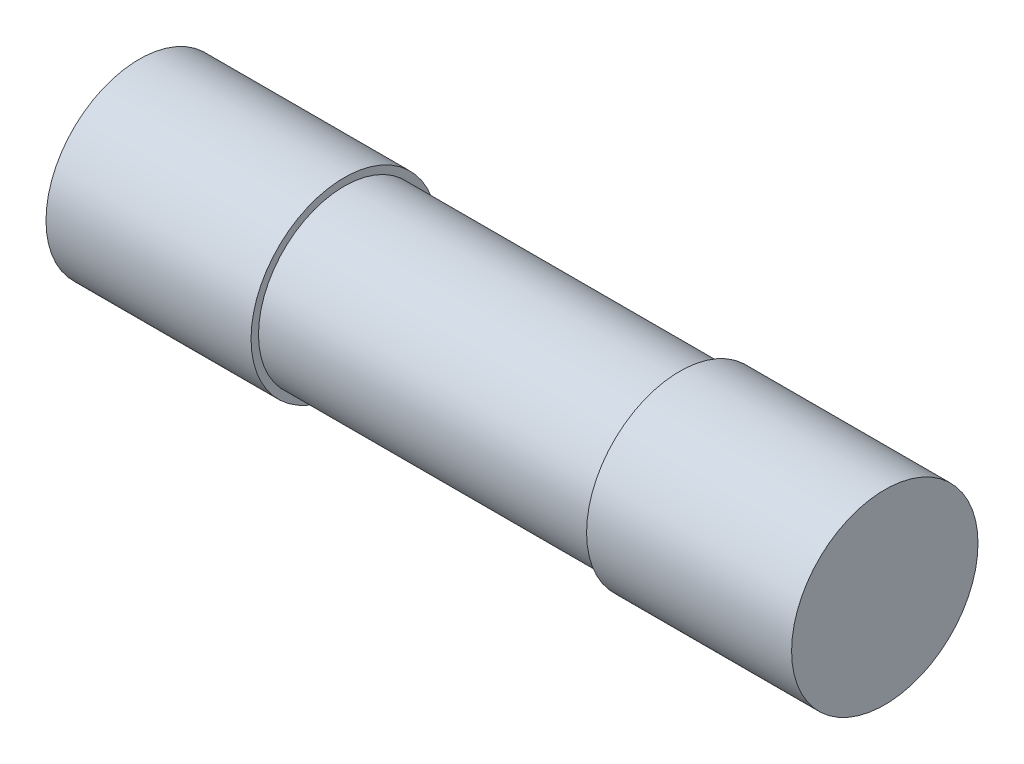
ISO-10303-21;
HEADER;
FILE_DESCRIPTION(('STEP AP214'),'2;1');
FILE_NAME('part.step','',(''),(''),'','','');
FILE_SCHEMA(('AUTOMOTIVE_DESIGN { 1 0 10303 214 1 1 1 1 }'));
ENDSEC;
DATA;
#1=APPLICATION_CONTEXT('core data for automotive mechanical design processes');
#2=APPLICATION_PROTOCOL_DEFINITION('international standard','automotive_design',2000,#1);
#3=PRODUCT_CONTEXT('',#1,'mechanical');
#4=PRODUCT('Part','Part','',(#3));
#5=PRODUCT_RELATED_PRODUCT_CATEGORY('part','',(#4));
#6=PRODUCT_DEFINITION_FORMATION('','',#4);
#7=PRODUCT_DEFINITION_CONTEXT('part definition',#1,'design');
#8=PRODUCT_DEFINITION('design','',#6,#7);
#9=PRODUCT_DEFINITION_SHAPE('','',#8);
#10=(LENGTH_UNIT() NAMED_UNIT(*) SI_UNIT(.MILLI.,.METRE.));
#11=(NAMED_UNIT(*) PLANE_ANGLE_UNIT() SI_UNIT($,.RADIAN.));
#12=(NAMED_UNIT(*) SI_UNIT($,.STERADIAN.) SOLID_ANGLE_UNIT());
#13=UNCERTAINTY_MEASURE_WITH_UNIT(LENGTH_MEASURE(1.E-05),#10,'distance_accuracy_value','');
#14=(GEOMETRIC_REPRESENTATION_CONTEXT(3) GLOBAL_UNCERTAINTY_ASSIGNED_CONTEXT((#13)) GLOBAL_UNIT_ASSIGNED_CONTEXT((#10,
#11,#12)) REPRESENTATION_CONTEXT('',''));
#15=CARTESIAN_POINT('',(0.,0.,0.));
#16=DIRECTION('',(0.,0.,1.));
#17=DIRECTION('',(1.,0.,0.));
#18=AXIS2_PLACEMENT_3D('',#15,#16,#17);
#19=CARTESIAN_POINT('',(20.,0.,0.));
#20=DIRECTION('',(-1.,0.,0.));
#21=DIRECTION('',(0.,0.,1.));
#22=AXIS2_PLACEMENT_3D('',#19,#20,#21);
#23=CYLINDRICAL_SURFACE('',#22,2.5);
#24=CARTESIAN_POINT('',(5.5,0.,0.));
#25=DIRECTION('',(-1.,0.,0.));
#26=DIRECTION('',(0.,0.,1.));
#27=AXIS2_PLACEMENT_3D('',#24,#25,#26);
#28=CIRCLE('',#27,2.5);
#29=CARTESIAN_POINT('',(5.5,0.,2.5));
#30=VERTEX_POINT('',#29);
#31=EDGE_CURVE('E66',#30,#30,#28,.T.);
#32=ORIENTED_EDGE('',*,*,#31,.T.);
#33=EDGE_LOOP('',(#32));
#34=FACE_BOUND('',#33,.T.);
#35=CARTESIAN_POINT('',(0.,0.,0.));
#36=DIRECTION('',(1.,0.,0.));
#37=DIRECTION('',(0.,0.,-1.));
#38=AXIS2_PLACEMENT_3D('',#35,#36,#37);
#39=CIRCLE('',#38,2.5);
#40=CARTESIAN_POINT('',(0.,0.,-2.5));
#41=VERTEX_POINT('',#40);
#42=EDGE_CURVE('E46',#41,#41,#39,.T.);
#43=ORIENTED_EDGE('',*,*,#42,.T.);
#44=EDGE_LOOP('',(#43));
#45=FACE_BOUND('',#44,.T.);
#46=ADVANCED_FACE('F35',(#34,#45),#23,.T.);
#47=CARTESIAN_POINT('',(0.,0.,0.));
#48=DIRECTION('',(1.,0.,0.));
#49=DIRECTION('',(0.,0.,-1.));
#50=AXIS2_PLACEMENT_3D('',#47,#48,#49);
#51=PLANE('',#50);
#52=ORIENTED_EDGE('',*,*,#42,.F.);
#53=EDGE_LOOP('',(#52));
#54=FACE_BOUND('',#53,.T.);
#55=ADVANCED_FACE('F99',(#54),#51,.F.);
#56=CARTESIAN_POINT('',(27.0710678118655,0.,0.));
#57=DIRECTION('',(-1.,0.,0.));
#58=DIRECTION('',(0.,0.,1.));
#59=AXIS2_PLACEMENT_3D('',#56,#57,#58);
#60=CYLINDRICAL_SURFACE('',#59,2.3);
#61=CARTESIAN_POINT('',(5.5,0.,0.));
#62=DIRECTION('',(-1.,0.,0.));
#63=DIRECTION('',(0.,0.,1.));
#64=AXIS2_PLACEMENT_3D('',#61,#62,#63);
#65=CIRCLE('',#64,2.3);
#66=CARTESIAN_POINT('',(5.5,0.,2.3));
#67=VERTEX_POINT('',#66);
#68=EDGE_CURVE('E62',#67,#67,#65,.T.);
#69=CARTESIAN_POINT('',(14.5,0.,0.));
#70=DIRECTION('',(1.,0.,0.));
#71=DIRECTION('',(0.,0.,-1.));
#72=AXIS2_PLACEMENT_3D('',#69,#70,#71);
#73=CIRCLE('',#72,2.3);
#74=CARTESIAN_POINT('',(14.5,0.,2.3));
#75=VERTEX_POINT('',#74);
#76=EDGE_CURVE('E56',#75,#75,#73,.F.);
#77=CARTESIAN_POINT('',(5.5,0.,2.3));
#78=CARTESIAN_POINT('',(5.59375,0.,2.3));
#79=CARTESIAN_POINT('',(5.6875,0.,2.3));
#80=CARTESIAN_POINT('',(5.875,0.,2.3));
#81=CARTESIAN_POINT('',(5.96875,0.,2.3));
#82=CARTESIAN_POINT('',(6.15625,0.,2.3));
#83=CARTESIAN_POINT('',(6.25,0.,2.3));
#84=CARTESIAN_POINT('',(6.4375,0.,2.3));
#85=CARTESIAN_POINT('',(6.53125,0.,2.3));
#86=CARTESIAN_POINT('',(6.71875,0.,2.3));
#87=CARTESIAN_POINT('',(6.8125,0.,2.3));
#88=CARTESIAN_POINT('',(7.,0.,2.3));
#89=CARTESIAN_POINT('',(7.09375,0.,2.3));
#90=CARTESIAN_POINT('',(7.28125,0.,2.3));
#91=CARTESIAN_POINT('',(7.375,0.,2.3));
#92=CARTESIAN_POINT('',(7.5625,0.,2.3));
#93=CARTESIAN_POINT('',(7.65625,0.,2.3));
#94=CARTESIAN_POINT('',(7.84375,0.,2.3));
#95=CARTESIAN_POINT('',(7.9375,0.,2.3));
#96=CARTESIAN_POINT('',(8.125,0.,2.3));
#97=CARTESIAN_POINT('',(8.21875,0.,2.3));
#98=CARTESIAN_POINT('',(8.40625,0.,2.3));
#99=CARTESIAN_POINT('',(8.5,0.,2.3));
#100=CARTESIAN_POINT('',(8.6875,0.,2.3));
#101=CARTESIAN_POINT('',(8.78125,0.,2.3));
#102=CARTESIAN_POINT('',(8.96875,0.,2.3));
#103=CARTESIAN_POINT('',(9.0625,0.,2.3));
#104=CARTESIAN_POINT('',(9.25,0.,2.3));
#105=CARTESIAN_POINT('',(9.34375,0.,2.3));
#106=CARTESIAN_POINT('',(9.53125,0.,2.3));
#107=CARTESIAN_POINT('',(9.625,0.,2.3));
#108=CARTESIAN_POINT('',(9.8125,0.,2.3));
#109=CARTESIAN_POINT('',(9.90625,0.,2.3));
#110=CARTESIAN_POINT('',(10.09375,0.,2.3));
#111=CARTESIAN_POINT('',(10.1875,0.,2.3));
#112=CARTESIAN_POINT('',(10.375,0.,2.3));
#113=CARTESIAN_POINT('',(10.46875,0.,2.3));
#114=CARTESIAN_POINT('',(10.65625,0.,2.3));
#115=CARTESIAN_POINT('',(10.75,0.,2.3));
#116=CARTESIAN_POINT('',(10.9375,0.,2.3));
#117=CARTESIAN_POINT('',(11.03125,0.,2.3));
#118=CARTESIAN_POINT('',(11.21875,0.,2.3));
#119=CARTESIAN_POINT('',(11.3125,0.,2.3));
#120=CARTESIAN_POINT('',(11.5,0.,2.3));
#121=CARTESIAN_POINT('',(11.59375,0.,2.3));
#122=CARTESIAN_POINT('',(11.78125,0.,2.3));
#123=CARTESIAN_POINT('',(11.875,0.,2.3));
#124=CARTESIAN_POINT('',(12.0625,0.,2.3));
#125=CARTESIAN_POINT('',(12.15625,0.,2.3));
#126=CARTESIAN_POINT('',(12.34375,0.,2.3));
#127=CARTESIAN_POINT('',(12.4375,0.,2.3));
#128=CARTESIAN_POINT('',(12.625,0.,2.3));
#129=CARTESIAN_POINT('',(12.71875,0.,2.3));
#130=CARTESIAN_POINT('',(12.90625,0.,2.3));
#131=CARTESIAN_POINT('',(13.,0.,2.3));
#132=CARTESIAN_POINT('',(13.1875,0.,2.3));
#133=CARTESIAN_POINT('',(13.28125,0.,2.3));
#134=CARTESIAN_POINT('',(13.46875,0.,2.3));
#135=CARTESIAN_POINT('',(13.5625,0.,2.3));
#136=CARTESIAN_POINT('',(13.75,0.,2.3));
#137=CARTESIAN_POINT('',(13.84375,0.,2.3));
#138=CARTESIAN_POINT('',(14.03125,0.,2.3));
#139=CARTESIAN_POINT('',(14.125,0.,2.3));
#140=CARTESIAN_POINT('',(14.3125,0.,2.3));
#141=CARTESIAN_POINT('',(14.40625,0.,2.3));
#142=CARTESIAN_POINT('',(14.5,0.,2.3));
#143=B_SPLINE_CURVE_WITH_KNOTS('',3,(#77,#78,#79,#80,#81,#82,#83,#84,#85,#86,#87,#88,#89,#90,
#91,#92,#93,#94,#95,#96,#97,#98,#99,#100,#101,#102,#103,#104,#105,#106,#107,#108,#109,#110,#111,
#112,#113,#114,#115,#116,#117,#118,#119,#120,#121,#122,#123,#124,#125,#126,#127,#128,#129,#130,
#131,#132,#133,#134,#135,#136,#137,#138,#139,#140,#141,#142),.UNSPECIFIED.,.F.,.F.,(4,2,2,2,2,2,
2,2,2,2,2,2,2,2,2,2,2,2,2,2,2,2,2,2,2,2,2,2,2,2,2,2,4),(0.,0.28125,0.5625,0.843750000000001,
1.125,1.40625,1.6875,1.96875,2.25,2.53125,2.8125,3.09375,3.375,3.65625,3.9375,4.21875,4.5,
4.78125,5.0625,5.34375,5.625,5.90625,6.1875,6.46875,6.75,7.03125,7.3125,7.59375,7.875,8.15625,
8.4375,8.71875,9.),.UNSPECIFIED.);
#144=EDGE_CURVE('BSEAM101',#67,#75,#143,.T.);
#145=ORIENTED_EDGE('',*,*,#68,.F.);
#146=ORIENTED_EDGE('',*,*,#76,.T.);
#147=ORIENTED_EDGE('',*,*,#144,.T.);
#148=ORIENTED_EDGE('',*,*,#144,.F.);
#149=EDGE_LOOP('',(#145,#147,#146,#148));
#150=FACE_BOUND('',#149,.T.);
#151=ADVANCED_FACE('F101',(#150),#60,.T.);
#152=CARTESIAN_POINT('',(5.5,0.,0.));
#153=DIRECTION('',(-1.,0.,0.));
#154=DIRECTION('',(0.,0.,1.));
#155=AXIS2_PLACEMENT_3D('',#152,#153,#154);
#156=PLANE('',#155);
#157=ORIENTED_EDGE('',*,*,#68,.T.);
#158=EDGE_LOOP('',(#157));
#159=FACE_BOUND('',#158,.T.);
#160=ORIENTED_EDGE('',*,*,#31,.F.);
#161=EDGE_LOOP('',(#160));
#162=FACE_BOUND('',#161,.T.);
#163=ADVANCED_FACE('F107',(#159,#162),#156,.F.);
#164=CARTESIAN_POINT('',(14.5,0.,0.));
#165=DIRECTION('',(1.,0.,0.));
#166=DIRECTION('',(0.,0.,-1.));
#167=AXIS2_PLACEMENT_3D('',#164,#165,#166);
#168=PLANE('',#167);
#169=CARTESIAN_POINT('',(14.5,0.,0.));
#170=DIRECTION('',(1.,0.,0.));
#171=DIRECTION('',(0.,0.,-1.));
#172=AXIS2_PLACEMENT_3D('',#169,#170,#171);
#173=CIRCLE('',#172,2.5);
#174=CARTESIAN_POINT('',(14.5,0.,-2.5));
#175=VERTEX_POINT('',#174);
#176=EDGE_CURVE('E59',#175,#175,#173,.F.);
#177=ORIENTED_EDGE('',*,*,#176,.T.);
#178=EDGE_LOOP('',(#177));
#179=FACE_BOUND('',#178,.T.);
#180=ORIENTED_EDGE('',*,*,#76,.F.);
#181=EDGE_LOOP('',(#180));
#182=FACE_BOUND('',#181,.T.);
#183=ADVANCED_FACE('F98',(#179,#182),#168,.F.);
#184=CARTESIAN_POINT('',(20.,0.,0.));
#185=DIRECTION('',(1.,0.,0.));
#186=DIRECTION('',(0.,0.,-1.));
#187=AXIS2_PLACEMENT_3D('',#184,#185,#186);
#188=PLANE('',#187);
#189=CARTESIAN_POINT('',(20.,0.,0.));
#190=DIRECTION('',(1.,0.,0.));
#191=DIRECTION('',(0.,0.,-1.));
#192=AXIS2_PLACEMENT_3D('',#189,#190,#191);
#193=CIRCLE('',#192,2.5);
#194=CARTESIAN_POINT('',(20.,0.,-2.5));
#195=VERTEX_POINT('',#194);
#196=EDGE_CURVE('E42',#195,#195,#193,.T.);
#197=ORIENTED_EDGE('',*,*,#196,.T.);
#198=EDGE_LOOP('',(#197));
#199=FACE_BOUND('',#198,.T.);
#200=ADVANCED_FACE('F96',(#199),#188,.T.);
#201=ORIENTED_EDGE('',*,*,#176,.F.);
#202=EDGE_LOOP('',(#201));
#203=FACE_BOUND('',#202,.T.);
#204=ORIENTED_EDGE('',*,*,#196,.F.);
#205=EDGE_LOOP('',(#204));
#206=FACE_BOUND('',#205,.T.);
#207=ADVANCED_FACE('F37',(#203,#206),#23,.T.);
#208=CLOSED_SHELL('',(#46,#55,#151,#163,#183,#200,#207));
#209=CARTESIAN_POINT('',(19.5,0.,0.));
#210=DIRECTION('',(-1.,0.,0.));
#211=DIRECTION('',(0.,0.,1.));
#212=AXIS2_PLACEMENT_3D('',#209,#210,#211);
#213=CYLINDRICAL_SURFACE('',#212,1.5);
#214=CARTESIAN_POINT('',(19.5,0.,0.));
#215=DIRECTION('',(1.,0.,0.));
#216=DIRECTION('',(0.,0.,-1.));
#217=AXIS2_PLACEMENT_3D('',#214,#215,#216);
#218=CIRCLE('',#217,1.5);
#219=CARTESIAN_POINT('',(19.5,0.,-1.5));
#220=VERTEX_POINT('',#219);
#221=EDGE_CURVE('E51',#220,#220,#218,.T.);
#222=ORIENTED_EDGE('',*,*,#221,.T.);
#223=EDGE_LOOP('',(#222));
#224=FACE_BOUND('',#223,.T.);
#225=CARTESIAN_POINT('',(0.5,0.,0.));
#226=DIRECTION('',(1.,0.,0.));
#227=DIRECTION('',(0.,0.,-1.));
#228=AXIS2_PLACEMENT_3D('',#225,#226,#227);
#229=CIRCLE('',#228,1.5);
#230=CARTESIAN_POINT('',(0.5,0.,-1.5));
#231=VERTEX_POINT('',#230);
#232=EDGE_CURVE('E53',#231,#231,#229,.T.);
#233=ORIENTED_EDGE('',*,*,#232,.F.);
#234=EDGE_LOOP('',(#233));
#235=FACE_BOUND('',#234,.T.);
#236=ADVANCED_FACE('F84',(#224,#235),#213,.F.);
#237=CARTESIAN_POINT('',(19.5,0.,0.));
#238=DIRECTION('',(1.,0.,0.));
#239=DIRECTION('',(0.,0.,-1.));
#240=AXIS2_PLACEMENT_3D('',#237,#238,#239);
#241=PLANE('',#240);
#242=CARTESIAN_POINT('',(19.5,0.,0.));
#243=DIRECTION('',(1.,0.,0.));
#244=DIRECTION('',(0.,0.,-1.));
#245=AXIS2_PLACEMENT_3D('',#242,#243,#244);
#246=CIRCLE('',#245,0.15);
#247=CARTESIAN_POINT('',(19.5,0.,-0.15));
#248=VERTEX_POINT('',#247);
#249=EDGE_CURVE('E11',#248,#248,#246,.F.);
#250=ORIENTED_EDGE('',*,*,#249,.F.);
#251=EDGE_LOOP('',(#250));
#252=FACE_BOUND('',#251,.T.);
#253=ORIENTED_EDGE('',*,*,#221,.F.);
#254=EDGE_LOOP('',(#253));
#255=FACE_BOUND('',#254,.T.);
#256=ADVANCED_FACE('F79',(#252,#255),#241,.F.);
#257=CARTESIAN_POINT('',(0.5,0.,0.));
#258=DIRECTION('',(1.,0.,0.));
#259=DIRECTION('',(0.,0.,-1.));
#260=AXIS2_PLACEMENT_3D('',#257,#258,#259);
#261=PLANE('',#260);
#262=CARTESIAN_POINT('',(0.5,0.,0.));
#263=DIRECTION('',(1.,0.,0.));
#264=DIRECTION('',(0.,0.,-1.));
#265=AXIS2_PLACEMENT_3D('',#262,#263,#264);
#266=CIRCLE('',#265,0.15);
#267=CARTESIAN_POINT('',(0.5,0.,-0.15));
#268=VERTEX_POINT('',#267);
#269=EDGE_CURVE('E63',#268,#268,#266,.T.);
#270=ORIENTED_EDGE('',*,*,#269,.F.);
#271=EDGE_LOOP('',(#270));
#272=FACE_BOUND('',#271,.T.);
#273=ORIENTED_EDGE('',*,*,#232,.T.);
#274=EDGE_LOOP('',(#273));
#275=FACE_BOUND('',#274,.T.);
#276=ADVANCED_FACE('F76',(#272,#275),#261,.T.);
#277=CARTESIAN_POINT('',(20.002,0.,0.));
#278=DIRECTION('',(-1.,0.,0.));
#279=DIRECTION('',(0.,0.,1.));
#280=AXIS2_PLACEMENT_3D('',#277,#278,#279);
#281=CYLINDRICAL_SURFACE('',#280,0.15);
#282=ORIENTED_EDGE('',*,*,#269,.T.);
#283=EDGE_LOOP('',(#282));
#284=FACE_BOUND('',#283,.T.);
#285=ORIENTED_EDGE('',*,*,#249,.T.);
#286=EDGE_LOOP('',(#285));
#287=FACE_BOUND('',#286,.T.);
#288=ADVANCED_FACE('F74',(#284,#287),#281,.T.);
#289=CLOSED_SHELL('',(#236,#256,#276,#288));
#290=ORIENTED_CLOSED_SHELL('',*,#289,.T.);
#291=BREP_WITH_VOIDS('B2',#208,(#290));
#292=ADVANCED_BREP_SHAPE_REPRESENTATION('',(#18,#291),#14);
#293=SHAPE_DEFINITION_REPRESENTATION(#9,#292);
ENDSEC;
END-ISO-10303-21;
